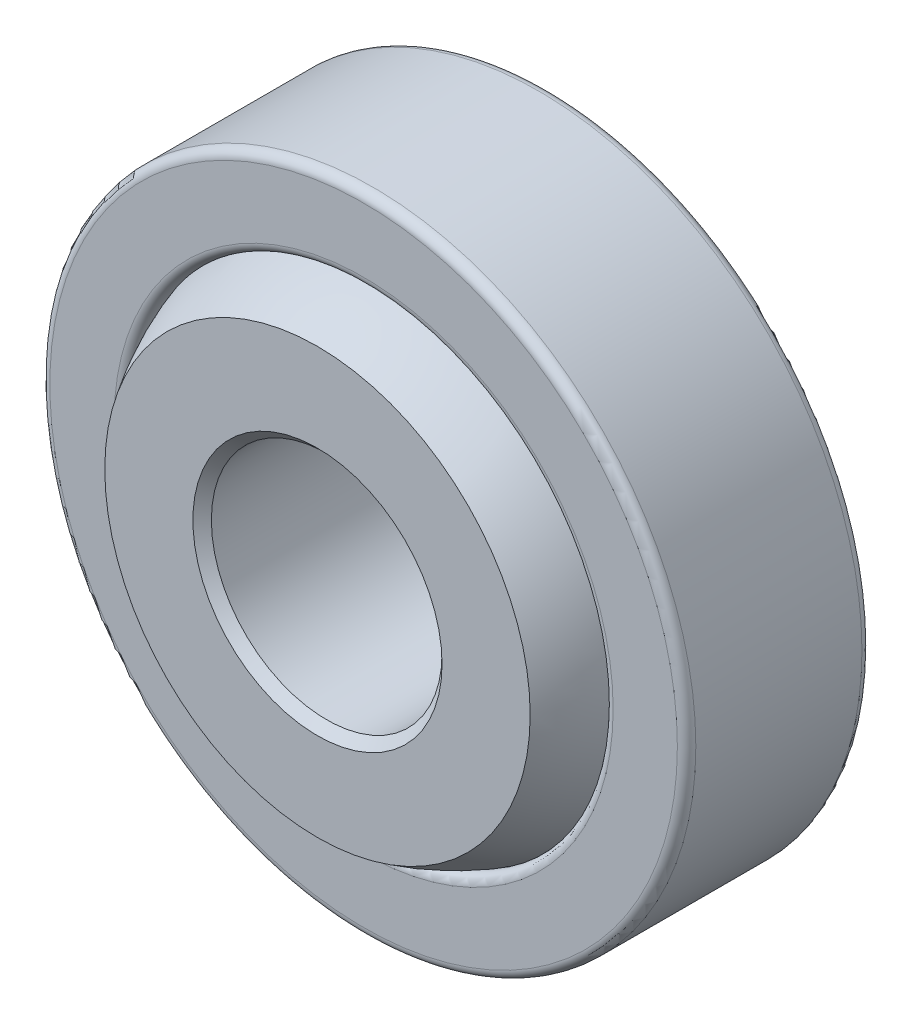
ISO-10303-21;
HEADER;
FILE_DESCRIPTION(('STEP AP214'),'2;1');
FILE_NAME('part.step','',(''),(''),'','','');
FILE_SCHEMA(('AUTOMOTIVE_DESIGN { 1 0 10303 214 1 1 1 1 }'));
ENDSEC;
DATA;
#1=APPLICATION_CONTEXT('core data for automotive mechanical design processes');
#2=APPLICATION_PROTOCOL_DEFINITION('international standard','automotive_design',2000,#1);
#3=PRODUCT_CONTEXT('',#1,'mechanical');
#4=PRODUCT('Part','Part','',(#3));
#5=PRODUCT_RELATED_PRODUCT_CATEGORY('part','',(#4));
#6=PRODUCT_DEFINITION_FORMATION('','',#4);
#7=PRODUCT_DEFINITION_CONTEXT('part definition',#1,'design');
#8=PRODUCT_DEFINITION('design','',#6,#7);
#9=PRODUCT_DEFINITION_SHAPE('','',#8);
#10=(LENGTH_UNIT() NAMED_UNIT(*) SI_UNIT(.MILLI.,.METRE.));
#11=(NAMED_UNIT(*) PLANE_ANGLE_UNIT() SI_UNIT($,.RADIAN.));
#12=(NAMED_UNIT(*) SI_UNIT($,.STERADIAN.) SOLID_ANGLE_UNIT());
#13=UNCERTAINTY_MEASURE_WITH_UNIT(LENGTH_MEASURE(1.E-05),#10,'distance_accuracy_value','');
#14=(GEOMETRIC_REPRESENTATION_CONTEXT(3) GLOBAL_UNCERTAINTY_ASSIGNED_CONTEXT((#13)) GLOBAL_UNIT_ASSIGNED_CONTEXT((#10,
#11,#12)) REPRESENTATION_CONTEXT('',''));
#15=CARTESIAN_POINT('',(0.,0.,0.));
#16=DIRECTION('',(0.,0.,1.));
#17=DIRECTION('',(1.,0.,0.));
#18=AXIS2_PLACEMENT_3D('',#15,#16,#17);
#19=CARTESIAN_POINT('',(0.,0.,2.));
#20=DIRECTION('',(0.,0.,-1.));
#21=DIRECTION('',(-1.,0.,0.));
#22=AXIS2_PLACEMENT_3D('',#19,#20,#21);
#23=CYLINDRICAL_SURFACE('',#22,7.);
#24=CARTESIAN_POINT('',(0.,0.,-1.8));
#25=DIRECTION('',(0.,0.,1.));
#26=DIRECTION('',(1.,0.,0.));
#27=AXIS2_PLACEMENT_3D('',#24,#25,#26);
#28=CIRCLE('',#27,7.);
#29=CARTESIAN_POINT('',(7.,0.,-1.8));
#30=VERTEX_POINT('',#29);
#31=EDGE_CURVE('P0_E10',#30,#30,#28,.T.);
#32=ORIENTED_EDGE('',*,*,#31,.T.);
#33=EDGE_LOOP('',(#32));
#34=FACE_BOUND('',#33,.T.);
#35=CARTESIAN_POINT('',(0.,0.,1.8));
#36=DIRECTION('',(0.,0.,1.));
#37=DIRECTION('',(1.,0.,0.));
#38=AXIS2_PLACEMENT_3D('',#35,#36,#37);
#39=CIRCLE('',#38,7.);
#40=CARTESIAN_POINT('',(7.,0.,1.8));
#41=VERTEX_POINT('',#40);
#42=EDGE_CURVE('P0_E22',#41,#41,#39,.F.);
#43=ORIENTED_EDGE('',*,*,#42,.T.);
#44=EDGE_LOOP('',(#43));
#45=FACE_BOUND('',#44,.T.);
#46=ADVANCED_FACE('P0_F15',(#34,#45),#23,.T.);
#47=CARTESIAN_POINT('',(0.,0.,2.));
#48=DIRECTION('',(0.,0.,1.));
#49=DIRECTION('',(1.,0.,0.));
#50=AXIS2_PLACEMENT_3D('',#47,#48,#49);
#51=PLANE('',#50);
#52=CARTESIAN_POINT('',(0.,0.,2.));
#53=DIRECTION('',(0.,0.,1.));
#54=DIRECTION('',(1.,0.,0.));
#55=AXIS2_PLACEMENT_3D('',#52,#53,#54);
#56=CIRCLE('',#55,5.40832691319598);
#57=CARTESIAN_POINT('',(5.40832691319598,0.,2.));
#58=VERTEX_POINT('',#57);
#59=EDGE_CURVE('P0_E26',#58,#58,#56,.F.);
#60=ORIENTED_EDGE('',*,*,#59,.T.);
#61=EDGE_LOOP('',(#60));
#62=FACE_BOUND('',#61,.T.);
#63=CARTESIAN_POINT('',(0.,0.,2.));
#64=DIRECTION('',(0.,0.,1.));
#65=DIRECTION('',(1.,0.,0.));
#66=AXIS2_PLACEMENT_3D('',#63,#64,#65);
#67=CIRCLE('',#66,6.8);
#68=CARTESIAN_POINT('',(6.8,0.,2.));
#69=VERTEX_POINT('',#68);
#70=EDGE_CURVE('P0_E30',#69,#69,#67,.T.);
#71=ORIENTED_EDGE('',*,*,#70,.T.);
#72=EDGE_LOOP('',(#71));
#73=FACE_BOUND('',#72,.T.);
#74=ADVANCED_FACE('P0_F65',(#62,#73),#51,.T.);
#75=CARTESIAN_POINT('',(0.,0.,-2.));
#76=DIRECTION('',(0.,0.,1.));
#77=DIRECTION('',(1.,0.,0.));
#78=AXIS2_PLACEMENT_3D('',#75,#76,#77);
#79=PLANE('',#78);
#80=CARTESIAN_POINT('',(0.,0.,-2.));
#81=DIRECTION('',(0.,0.,1.));
#82=DIRECTION('',(1.,0.,0.));
#83=AXIS2_PLACEMENT_3D('',#80,#81,#82);
#84=CIRCLE('',#83,5.40832691319598);
#85=CARTESIAN_POINT('',(5.40832691319598,0.,-2.));
#86=VERTEX_POINT('',#85);
#87=EDGE_CURVE('P0_E41',#86,#86,#84,.T.);
#88=ORIENTED_EDGE('',*,*,#87,.T.);
#89=EDGE_LOOP('',(#88));
#90=FACE_BOUND('',#89,.T.);
#91=CARTESIAN_POINT('',(0.,0.,-2.));
#92=DIRECTION('',(0.,0.,1.));
#93=DIRECTION('',(1.,0.,0.));
#94=AXIS2_PLACEMENT_3D('',#91,#92,#93);
#95=CIRCLE('',#94,6.8);
#96=CARTESIAN_POINT('',(6.8,0.,-2.));
#97=VERTEX_POINT('',#96);
#98=EDGE_CURVE('P0_E44',#97,#97,#95,.F.);
#99=ORIENTED_EDGE('',*,*,#98,.T.);
#100=EDGE_LOOP('',(#99));
#101=FACE_BOUND('',#100,.T.);
#102=ADVANCED_FACE('P0_F48',(#90,#101),#79,.F.);
#103=CARTESIAN_POINT('',(0.,0.,0.));
#104=DIRECTION('',(0.,0.,-1.));
#105=DIRECTION('',(1.,0.,0.));
#106=AXIS2_PLACEMENT_3D('',#103,#104,#105);
#107=SPHERICAL_SURFACE('',#106,5.5);
#108=CARTESIAN_POINT('',(0.,0.,-1.73684210526316));
#109=DIRECTION('',(0.,0.,1.));
#110=DIRECTION('',(1.,0.,0.));
#111=AXIS2_PLACEMENT_3D('',#108,#109,#110);
#112=CIRCLE('',#111,5.21856105659262);
#113=CARTESIAN_POINT('',(5.21856105659262,0.,-1.73684210526316));
#114=VERTEX_POINT('',#113);
#115=EDGE_CURVE('P0_E35',#114,#114,#112,.F.);
#116=CARTESIAN_POINT('',(0.,0.,1.73684210526316));
#117=DIRECTION('',(0.,0.,-1.));
#118=DIRECTION('',(-1.,0.,0.));
#119=AXIS2_PLACEMENT_3D('',#116,#117,#118);
#120=CIRCLE('',#119,5.21856105659262);
#121=CARTESIAN_POINT('',(5.21856105659262,0.,1.73684210526316));
#122=VERTEX_POINT('',#121);
#123=EDGE_CURVE('P0_E38',#122,#122,#120,.F.);
#124=CARTESIAN_POINT('',(5.21856105659262,0.,-1.73684210526316));
#125=CARTESIAN_POINT('',(5.23018668165004,0.,-1.70191161867671));
#126=CARTESIAN_POINT('',(5.24146149476915,0.,-1.66686437678149));
#127=CARTESIAN_POINT('',(5.26330517545796,0.,-1.59655058366803));
#128=CARTESIAN_POINT('',(5.27387404302766,0.,-1.56128403244977));
#129=CARTESIAN_POINT('',(5.29430151094487,0.,-1.49054582198468));
#130=CARTESIAN_POINT('',(5.30416011129239,0.,-1.45507416273784));
#131=CARTESIAN_POINT('',(5.32316308575347,0.,-1.38394004390697));
#132=CARTESIAN_POINT('',(5.33230745986704,0.,-1.34827758432293));
#133=CARTESIAN_POINT('',(5.34987829039802,0.,-1.27677624309357));
#134=CARTESIAN_POINT('',(5.35830474681544,0.,-1.24093736144826));
#135=CARTESIAN_POINT('',(5.37443634544268,0.,-1.16909762720937));
#136=CARTESIAN_POINT('',(5.38214148765251,0.,-1.1330967746158));
#137=CARTESIAN_POINT('',(5.39682735073012,0.,-1.06094761444662));
#138=CARTESIAN_POINT('',(5.40380807159791,0.,-1.02479930687101));
#139=CARTESIAN_POINT('',(5.41704227734729,0.,-0.952369812282071));
#140=CARTESIAN_POINT('',(5.42329576222888,0.,-0.916088625268748));
#141=CARTESIAN_POINT('',(5.43507297448838,0.,-0.843408000894892));
#142=CARTESIAN_POINT('',(5.44059670186629,0.,-0.80700856353436));
#143=CARTESIAN_POINT('',(5.45091217187792,0.,-0.734106115245605));
#144=CARTESIAN_POINT('',(5.45570391451164,0.,-0.697603104317382));
#145=CARTESIAN_POINT('',(5.46455348293361,0.,-0.624508227432768));
#146=CARTESIAN_POINT('',(5.46861130872187,0.,-0.587916361476376));
#147=CARTESIAN_POINT('',(5.4759914072795,0.,-0.514658528903206));
#148=CARTESIAN_POINT('',(5.47931368004888,0.,-0.477992562286426));
#149=CARTESIAN_POINT('',(5.4852213329804,0.,-0.404601312638544));
#150=CARTESIAN_POINT('',(5.48780671314254,0.,-0.367876029607442));
#151=CARTESIAN_POINT('',(5.49223953839707,0.,-0.294380955294258));
#152=CARTESIAN_POINT('',(5.49408698348946,0.,-0.257611164012176));
#153=CARTESIAN_POINT('',(5.497043193688,0.,-0.184041899306733));
#154=CARTESIAN_POINT('',(5.49815195879415,0.,-0.147242425883372));
#155=CARTESIAN_POINT('',(5.49963036195015,0.,-0.0736286349733409));
#156=CARTESIAN_POINT('',(5.5,0.,-0.0368143174866704));
#157=CARTESIAN_POINT('',(5.5,0.,0.0368143174866704));
#158=CARTESIAN_POINT('',(5.49963036195015,0.,0.0736286349733409));
#159=CARTESIAN_POINT('',(5.49815195879415,0.,0.147242425883372));
#160=CARTESIAN_POINT('',(5.497043193688,0.,0.184041899306733));
#161=CARTESIAN_POINT('',(5.49408698348946,0.,0.257611164012176));
#162=CARTESIAN_POINT('',(5.49223953839707,0.,0.294380955294258));
#163=CARTESIAN_POINT('',(5.48780671314254,0.,0.367876029607442));
#164=CARTESIAN_POINT('',(5.4852213329804,0.,0.404601312638544));
#165=CARTESIAN_POINT('',(5.47931368004888,0.,0.477992562286426));
#166=CARTESIAN_POINT('',(5.4759914072795,0.,0.514658528903206));
#167=CARTESIAN_POINT('',(5.46861130872187,0.,0.587916361476376));
#168=CARTESIAN_POINT('',(5.46455348293361,0.,0.624508227432768));
#169=CARTESIAN_POINT('',(5.45570391451164,0.,0.697603104317382));
#170=CARTESIAN_POINT('',(5.45091217187792,0.,0.734106115245605));
#171=CARTESIAN_POINT('',(5.44059670186629,0.,0.80700856353436));
#172=CARTESIAN_POINT('',(5.43507297448838,0.,0.843408000894892));
#173=CARTESIAN_POINT('',(5.42329576222888,0.,0.916088625268747));
#174=CARTESIAN_POINT('',(5.41704227734729,0.,0.952369812282071));
#175=CARTESIAN_POINT('',(5.40380807159791,0.,1.02479930687101));
#176=CARTESIAN_POINT('',(5.39682735073012,0.,1.06094761444662));
#177=CARTESIAN_POINT('',(5.38214148765251,0.,1.1330967746158));
#178=CARTESIAN_POINT('',(5.37443634544268,0.,1.16909762720937));
#179=CARTESIAN_POINT('',(5.35830474681544,0.,1.24093736144826));
#180=CARTESIAN_POINT('',(5.34987829039802,0.,1.27677624309357));
#181=CARTESIAN_POINT('',(5.33230745986704,0.,1.34827758432293));
#182=CARTESIAN_POINT('',(5.32316308575347,0.,1.38394004390697));
#183=CARTESIAN_POINT('',(5.30416011129239,0.,1.45507416273784));
#184=CARTESIAN_POINT('',(5.29430151094487,0.,1.49054582198468));
#185=CARTESIAN_POINT('',(5.27387404302766,0.,1.56128403244977));
#186=CARTESIAN_POINT('',(5.26330517545796,0.,1.59655058366803));
#187=CARTESIAN_POINT('',(5.24146149476915,0.,1.66686437678149));
#188=CARTESIAN_POINT('',(5.23018668165004,0.,1.70191161867671));
#189=CARTESIAN_POINT('',(5.21856105659262,0.,1.73684210526316));
#190=B_SPLINE_CURVE_WITH_KNOTS('',3,(#124,#125,#126,#127,#128,#129,#130,#131,#132,#133,#134,
#135,#136,#137,#138,#139,#140,#141,#142,#143,#144,#145,#146,#147,#148,#149,#150,#151,#152,#153,
#154,#155,#156,#157,#158,#159,#160,#161,#162,#163,#164,#165,#166,#167,#168,#169,#170,#171,#172,
#173,#174,#175,#176,#177,#178,#179,#180,#181,#182,#183,#184,#185,#186,#187,#188,#189),
.UNSPECIFIED.,.F.,.F.,(4,2,2,2,2,2,2,2,2,2,2,2,2,2,2,2,2,2,2,2,2,2,2,2,2,2,2,2,2,2,2,2,4),(0.,
0.110441096998865,0.220882193997731,0.331323290996596,0.441764387995462,0.552205484994327,
0.662646581993192,0.773087678992057,0.883528775990923,0.993969872989788,1.10441096998865,
1.21485206698752,1.32529316398638,1.43573426098525,1.54617535798412,1.65661645498298,
1.76705755198185,1.87749864898071,1.98793974597958,2.09838084297844,2.20882193997731,
2.31926303697617,2.42970413397504,2.5401452309739,2.65058632797277,2.76102742497163,
2.8714685219705,2.98190961896937,3.09235071596823,3.2027918129671,3.31323290996596,
3.42367400696483,3.53411510396369),.UNSPECIFIED.);
#191=EDGE_CURVE('P0_BSEAM76',#114,#122,#190,.T.);
#192=ORIENTED_EDGE('',*,*,#115,.T.);
#193=ORIENTED_EDGE('',*,*,#123,.T.);
#194=ORIENTED_EDGE('',*,*,#191,.T.);
#195=ORIENTED_EDGE('',*,*,#191,.F.);
#196=EDGE_LOOP('',(#192,#194,#193,#195));
#197=FACE_BOUND('',#196,.T.);
#198=ADVANCED_FACE('P0_F76',(#197),#107,.F.);
#199=CARTESIAN_POINT('',(0.,0.,-1.8));
#200=DIRECTION('',(0.,0.,1.));
#201=DIRECTION('',(1.,0.,0.));
#202=AXIS2_PLACEMENT_3D('',#199,#200,#201);
#203=TOROIDAL_SURFACE('',#202,5.40832691319598,0.2);
#204=ORIENTED_EDGE('',*,*,#115,.F.);
#205=EDGE_LOOP('',(#204));
#206=FACE_BOUND('',#205,.T.);
#207=ORIENTED_EDGE('',*,*,#87,.F.);
#208=EDGE_LOOP('',(#207));
#209=FACE_BOUND('',#208,.T.);
#210=ADVANCED_FACE('P0_F61',(#206,#209),#203,.T.);
#211=CARTESIAN_POINT('',(0.,0.,1.8));
#212=DIRECTION('',(0.,0.,1.));
#213=DIRECTION('',(1.,0.,0.));
#214=AXIS2_PLACEMENT_3D('',#211,#212,#213);
#215=TOROIDAL_SURFACE('',#214,5.40832691319598,0.2);
#216=ORIENTED_EDGE('',*,*,#59,.F.);
#217=EDGE_LOOP('',(#216));
#218=FACE_BOUND('',#217,.T.);
#219=ORIENTED_EDGE('',*,*,#123,.F.);
#220=EDGE_LOOP('',(#219));
#221=FACE_BOUND('',#220,.T.);
#222=ADVANCED_FACE('P0_F53',(#218,#221),#215,.T.);
#223=CARTESIAN_POINT('',(0.,0.,-1.8));
#224=DIRECTION('',(0.,0.,1.));
#225=DIRECTION('',(1.,0.,0.));
#226=AXIS2_PLACEMENT_3D('',#223,#224,#225);
#227=TOROIDAL_SURFACE('',#226,6.8,0.2);
#228=ORIENTED_EDGE('',*,*,#98,.F.);
#229=EDGE_LOOP('',(#228));
#230=FACE_BOUND('',#229,.T.);
#231=ORIENTED_EDGE('',*,*,#31,.F.);
#232=EDGE_LOOP('',(#231));
#233=FACE_BOUND('',#232,.T.);
#234=ADVANCED_FACE('P0_F50',(#230,#233),#227,.T.);
#235=CARTESIAN_POINT('',(0.,0.,1.8));
#236=DIRECTION('',(0.,0.,1.));
#237=DIRECTION('',(1.,0.,0.));
#238=AXIS2_PLACEMENT_3D('',#235,#236,#237);
#239=TOROIDAL_SURFACE('',#238,6.8,0.2);
#240=ORIENTED_EDGE('',*,*,#42,.F.);
#241=EDGE_LOOP('',(#240));
#242=FACE_BOUND('',#241,.T.);
#243=ORIENTED_EDGE('',*,*,#70,.F.);
#244=EDGE_LOOP('',(#243));
#245=FACE_BOUND('',#244,.T.);
#246=ADVANCED_FACE('P0_F17',(#242,#245),#239,.T.);
#247=CLOSED_SHELL('',(#46,#74,#102,#198,#210,#222,#234,#246));
#248=MANIFOLD_SOLID_BREP('P0_B1',#247);
#249=CARTESIAN_POINT('',(0.,0.,0.));
#250=DIRECTION('',(0.,0.,-1.));
#251=DIRECTION('',(-1.,0.,0.));
#252=AXIS2_PLACEMENT_3D('',#249,#250,#251);
#253=SPHERICAL_SURFACE('',#252,5.5);
#254=CARTESIAN_POINT('',(0.,0.,3.));
#255=DIRECTION('',(0.,0.,-1.));
#256=DIRECTION('',(-1.,0.,0.));
#257=AXIS2_PLACEMENT_3D('',#254,#255,#256);
#258=CIRCLE('',#257,4.60977222864645);
#259=CARTESIAN_POINT('',(-4.60977222864644,0.,3.));
#260=VERTEX_POINT('',#259);
#261=EDGE_CURVE('P1_E35',#260,#260,#258,.T.);
#262=CARTESIAN_POINT('',(0.,0.,-3.));
#263=DIRECTION('',(0.,0.,-1.));
#264=DIRECTION('',(-1.,0.,0.));
#265=AXIS2_PLACEMENT_3D('',#262,#263,#264);
#266=CIRCLE('',#265,4.60977222864645);
#267=CARTESIAN_POINT('',(-4.60977222864644,0.,-3.));
#268=VERTEX_POINT('',#267);
#269=EDGE_CURVE('P1_E38',#268,#268,#266,.T.);
#270=CARTESIAN_POINT('',(-4.60977222864644,0.,3.));
#271=CARTESIAN_POINT('',(-4.64583091444831,0.,2.94459357677976));
#272=CARTESIAN_POINT('',(-4.68088973234201,0.,2.88853648960918));
#273=CARTESIAN_POINT('',(-4.74896414892499,0.,2.7751951228486));
#274=CARTESIAN_POINT('',(-4.78197974761428,0.,2.71791084325861));
#275=CARTESIAN_POINT('',(-4.84592424240034,0.,2.6021892271405));
#276=CARTESIAN_POINT('',(-4.87685313849712,0.,2.54375189061237));
#277=CARTESIAN_POINT('',(-4.9365841692872,0.,2.42580022262547));
#278=CARTESIAN_POINT('',(-4.9653863039805,0.,2.36628589116669));
#279=CARTESIAN_POINT('',(-5.02082632734303,0.,2.24625758093135));
#280=CARTESIAN_POINT('',(-5.04746421601227,0.,2.18574360215479));
#281=CARTESIAN_POINT('',(-5.09854112744337,0.,2.06379467518424));
#282=CARTESIAN_POINT('',(-5.12298015020523,0.,2.00235972699026));
#283=CARTESIAN_POINT('',(-5.16962755488915,0.,1.87864872817082));
#284=CARTESIAN_POINT('',(-5.1918359368112,0.,1.81637267754536));
#285=CARTESIAN_POINT('',(-5.23399318850457,0.,1.69106043653073));
#286=CARTESIAN_POINT('',(-5.25394205827588,0.,1.62802424614157));
#287=CARTESIAN_POINT('',(-5.29155435086062,0.,1.50127367589927));
#288=CARTESIAN_POINT('',(-5.30921777367404,0.,1.43755929604614));
#289=CARTESIAN_POINT('',(-5.34223620900271,0.,1.30953517901649));
#290=CARTESIAN_POINT('',(-5.35759122151797,0.,1.24522544183997));
#291=CARTESIAN_POINT('',(-5.38597287389652,0.,1.11609421625814));
#292=CARTESIAN_POINT('',(-5.39899951375983,0.,1.05127272785284));
#293=CARTESIAN_POINT('',(-5.42270748550878,0.,0.921202271223425));
#294=CARTESIAN_POINT('',(-5.43338881739443,0.,0.855953302999315));
#295=CARTESIAN_POINT('',(-5.45239228688333,0.,0.725112713885887));
#296=CARTESIAN_POINT('',(-5.46071442448659,0.,0.659521092996569));
#297=CARTESIAN_POINT('',(-5.47498868618626,0.,0.528080471173961));
#298=CARTESIAN_POINT('',(-5.48094081028268,0.,0.46223147024067));
#299=CARTESIAN_POINT('',(-5.49046730688841,0.,0.33036169555898));
#300=CARTESIAN_POINT('',(-5.49404167939773,0.,0.26434092181058));
#301=CARTESIAN_POINT('',(-5.49880802595352,0.,0.132213432041454));
#302=CARTESIAN_POINT('',(-5.5,0.,0.0661067160207272));
#303=CARTESIAN_POINT('',(-5.5,0.,-0.0661067160207258));
#304=CARTESIAN_POINT('',(-5.49880802595352,0.,-0.132213432041452));
#305=CARTESIAN_POINT('',(-5.49404167939773,0.,-0.264340921810579));
#306=CARTESIAN_POINT('',(-5.49046730688841,0.,-0.330361695558979));
#307=CARTESIAN_POINT('',(-5.48094081028268,0.,-0.462231470240669));
#308=CARTESIAN_POINT('',(-5.47498868618626,0.,-0.528080471173959));
#309=CARTESIAN_POINT('',(-5.46071442448659,0.,-0.659521092996568));
#310=CARTESIAN_POINT('',(-5.45239228688333,0.,-0.725112713885886));
#311=CARTESIAN_POINT('',(-5.43338881739443,0.,-0.855953302999313));
#312=CARTESIAN_POINT('',(-5.42270748550878,0.,-0.921202271223423));
#313=CARTESIAN_POINT('',(-5.39899951375983,0.,-1.05127272785284));
#314=CARTESIAN_POINT('',(-5.38597287389652,0.,-1.11609421625814));
#315=CARTESIAN_POINT('',(-5.35759122151797,0.,-1.24522544183996));
#316=CARTESIAN_POINT('',(-5.34223620900271,0.,-1.30953517901648));
#317=CARTESIAN_POINT('',(-5.30921777367404,0.,-1.43755929604614));
#318=CARTESIAN_POINT('',(-5.29155435086062,0.,-1.50127367589927));
#319=CARTESIAN_POINT('',(-5.25394205827588,0.,-1.62802424614157));
#320=CARTESIAN_POINT('',(-5.23399318850457,0.,-1.69106043653073));
#321=CARTESIAN_POINT('',(-5.1918359368112,0.,-1.81637267754536));
#322=CARTESIAN_POINT('',(-5.16962755488915,0.,-1.87864872817082));
#323=CARTESIAN_POINT('',(-5.12298015020523,0.,-2.00235972699026));
#324=CARTESIAN_POINT('',(-5.09854112744337,0.,-2.06379467518424));
#325=CARTESIAN_POINT('',(-5.04746421601227,0.,-2.18574360215479));
#326=CARTESIAN_POINT('',(-5.02082632734303,0.,-2.24625758093135));
#327=CARTESIAN_POINT('',(-4.9653863039805,0.,-2.36628589116669));
#328=CARTESIAN_POINT('',(-4.9365841692872,0.,-2.42580022262547));
#329=CARTESIAN_POINT('',(-4.87685313849712,0.,-2.54375189061237));
#330=CARTESIAN_POINT('',(-4.84592424240034,0.,-2.6021892271405));
#331=CARTESIAN_POINT('',(-4.78197974761428,0.,-2.71791084325861));
#332=CARTESIAN_POINT('',(-4.74896414892499,0.,-2.7751951228486));
#333=CARTESIAN_POINT('',(-4.68088973234201,0.,-2.88853648960918));
#334=CARTESIAN_POINT('',(-4.64583091444831,0.,-2.94459357677976));
#335=CARTESIAN_POINT('',(-4.60977222864644,0.,-3.));
#336=B_SPLINE_CURVE_WITH_KNOTS('',3,(#270,#271,#272,#273,#274,#275,#276,#277,#278,#279,#280,
#281,#282,#283,#284,#285,#286,#287,#288,#289,#290,#291,#292,#293,#294,#295,#296,#297,#298,#299,
#300,#301,#302,#303,#304,#305,#306,#307,#308,#309,#310,#311,#312,#313,#314,#315,#316,#317,#318,
#319,#320,#321,#322,#323,#324,#325,#326,#327,#328,#329,#330,#331,#332,#333,#334,#335),
.UNSPECIFIED.,.F.,.F.,(4,2,2,2,2,2,2,2,2,2,2,2,2,2,2,2,2,2,2,2,2,2,2,2,2,2,2,2,2,2,2,2,4),(0.,
0.198309406151453,0.396618812302905,0.594928218454358,0.793237624605811,0.991547030757263,
1.18985643690872,1.38816584306017,1.58647524921162,1.78478465536307,1.98309406151453,
2.18140346766598,2.37971287381743,2.57802227996888,2.77633168612034,2.97464109227179,
3.17295049842324,3.37125990457469,3.56956931072615,3.7678787168776,3.96618812302905,
4.16449752918051,4.36280693533196,4.56111634148341,4.75942574763486,4.95773515378632,
5.15604455993777,5.35435396608922,5.55266337224067,5.75097277839213,5.94928218454358,
6.14759159069503,6.34590099684648),.UNSPECIFIED.);
#337=EDGE_CURVE('P1_BSEAM15',#260,#268,#336,.T.);
#338=ORIENTED_EDGE('',*,*,#261,.T.);
#339=ORIENTED_EDGE('',*,*,#269,.F.);
#340=ORIENTED_EDGE('',*,*,#337,.T.);
#341=ORIENTED_EDGE('',*,*,#337,.F.);
#342=EDGE_LOOP('',(#338,#340,#339,#341));
#343=FACE_BOUND('',#342,.T.);
#344=ADVANCED_FACE('P1_F15',(#343),#253,.T.);
#345=CARTESIAN_POINT('',(-2.5,0.,3.));
#346=DIRECTION('',(0.,0.,1.));
#347=DIRECTION('',(1.,0.,0.));
#348=AXIS2_PLACEMENT_3D('',#345,#346,#347);
#349=PLANE('',#348);
#350=CARTESIAN_POINT('',(0.,0.,3.));
#351=DIRECTION('',(0.,0.,1.));
#352=DIRECTION('',(1.,0.,0.));
#353=AXIS2_PLACEMENT_3D('',#350,#351,#352);
#354=CIRCLE('',#353,2.7);
#355=CARTESIAN_POINT('',(2.7,0.,3.));
#356=VERTEX_POINT('',#355);
#357=EDGE_CURVE('P1_E10',#356,#356,#354,.F.);
#358=ORIENTED_EDGE('',*,*,#357,.T.);
#359=EDGE_LOOP('',(#358));
#360=FACE_BOUND('',#359,.T.);
#361=ORIENTED_EDGE('',*,*,#261,.F.);
#362=EDGE_LOOP('',(#361));
#363=FACE_BOUND('',#362,.T.);
#364=ADVANCED_FACE('P1_F45',(#360,#363),#349,.T.);
#365=CARTESIAN_POINT('',(0.,0.,-4.35295991920589));
#366=DIRECTION('',(0.,0.,-1.));
#367=DIRECTION('',(-1.,0.,0.));
#368=AXIS2_PLACEMENT_3D('',#365,#366,#367);
#369=CYLINDRICAL_SURFACE('',#368,2.5);
#370=CARTESIAN_POINT('',(0.,0.,-2.8));
#371=DIRECTION('',(0.,0.,-1.));
#372=DIRECTION('',(-1.,0.,0.));
#373=AXIS2_PLACEMENT_3D('',#370,#371,#372);
#374=CIRCLE('',#373,2.5);
#375=CARTESIAN_POINT('',(-2.5,0.,-2.8));
#376=VERTEX_POINT('',#375);
#377=EDGE_CURVE('P1_E26',#376,#376,#374,.T.);
#378=ORIENTED_EDGE('',*,*,#377,.T.);
#379=EDGE_LOOP('',(#378));
#380=FACE_BOUND('',#379,.T.);
#381=CARTESIAN_POINT('',(0.,0.,2.8));
#382=DIRECTION('',(0.,0.,1.));
#383=DIRECTION('',(1.,0.,0.));
#384=AXIS2_PLACEMENT_3D('',#381,#382,#383);
#385=CIRCLE('',#384,2.5);
#386=CARTESIAN_POINT('',(2.5,0.,2.8));
#387=VERTEX_POINT('',#386);
#388=EDGE_CURVE('P1_E30',#387,#387,#385,.T.);
#389=ORIENTED_EDGE('',*,*,#388,.T.);
#390=EDGE_LOOP('',(#389));
#391=FACE_BOUND('',#390,.T.);
#392=ADVANCED_FACE('P1_F53',(#380,#391),#369,.F.);
#393=CARTESIAN_POINT('',(-4.60977222864645,0.,-3.));
#394=DIRECTION('',(0.,0.,-1.));
#395=DIRECTION('',(-1.,0.,0.));
#396=AXIS2_PLACEMENT_3D('',#393,#394,#395);
#397=PLANE('',#396);
#398=CARTESIAN_POINT('',(0.,0.,-3.));
#399=DIRECTION('',(0.,0.,-1.));
#400=DIRECTION('',(-1.,0.,0.));
#401=AXIS2_PLACEMENT_3D('',#398,#399,#400);
#402=CIRCLE('',#401,2.7);
#403=CARTESIAN_POINT('',(-2.7,0.,-3.));
#404=VERTEX_POINT('',#403);
#405=EDGE_CURVE('P1_E22',#404,#404,#402,.F.);
#406=ORIENTED_EDGE('',*,*,#405,.T.);
#407=EDGE_LOOP('',(#406));
#408=FACE_BOUND('',#407,.T.);
#409=ORIENTED_EDGE('',*,*,#269,.T.);
#410=EDGE_LOOP('',(#409));
#411=FACE_BOUND('',#410,.T.);
#412=ADVANCED_FACE('P1_F42',(#408,#411),#397,.T.);
#413=CARTESIAN_POINT('',(0.,0.,-2.8));
#414=DIRECTION('',(0.,0.,-1.));
#415=DIRECTION('',(-1.,0.,0.));
#416=AXIS2_PLACEMENT_3D('',#413,#414,#415);
#417=CONICAL_SURFACE('',#416,2.5,0.785398163397449);
#418=ORIENTED_EDGE('',*,*,#405,.F.);
#419=EDGE_LOOP('',(#418));
#420=FACE_BOUND('',#419,.T.);
#421=ORIENTED_EDGE('',*,*,#377,.F.);
#422=EDGE_LOOP('',(#421));
#423=FACE_BOUND('',#422,.T.);
#424=ADVANCED_FACE('P1_F56',(#420,#423),#417,.F.);
#425=CARTESIAN_POINT('',(0.,0.,3.));
#426=DIRECTION('',(0.,0.,1.));
#427=DIRECTION('',(1.,0.,0.));
#428=AXIS2_PLACEMENT_3D('',#425,#426,#427);
#429=CONICAL_SURFACE('',#428,2.7,0.785398163397448);
#430=ORIENTED_EDGE('',*,*,#388,.F.);
#431=EDGE_LOOP('',(#430));
#432=FACE_BOUND('',#431,.T.);
#433=ORIENTED_EDGE('',*,*,#357,.F.);
#434=EDGE_LOOP('',(#433));
#435=FACE_BOUND('',#434,.T.);
#436=ADVANCED_FACE('P1_F17',(#432,#435),#429,.F.);
#437=CLOSED_SHELL('',(#344,#364,#392,#412,#424,#436));
#438=MANIFOLD_SOLID_BREP('P1_B1',#437);
#439=ADVANCED_BREP_SHAPE_REPRESENTATION('',(#18,#248,#438),#14);
#440=SHAPE_DEFINITION_REPRESENTATION(#9,#439);
ENDSEC;
END-ISO-10303-21;
